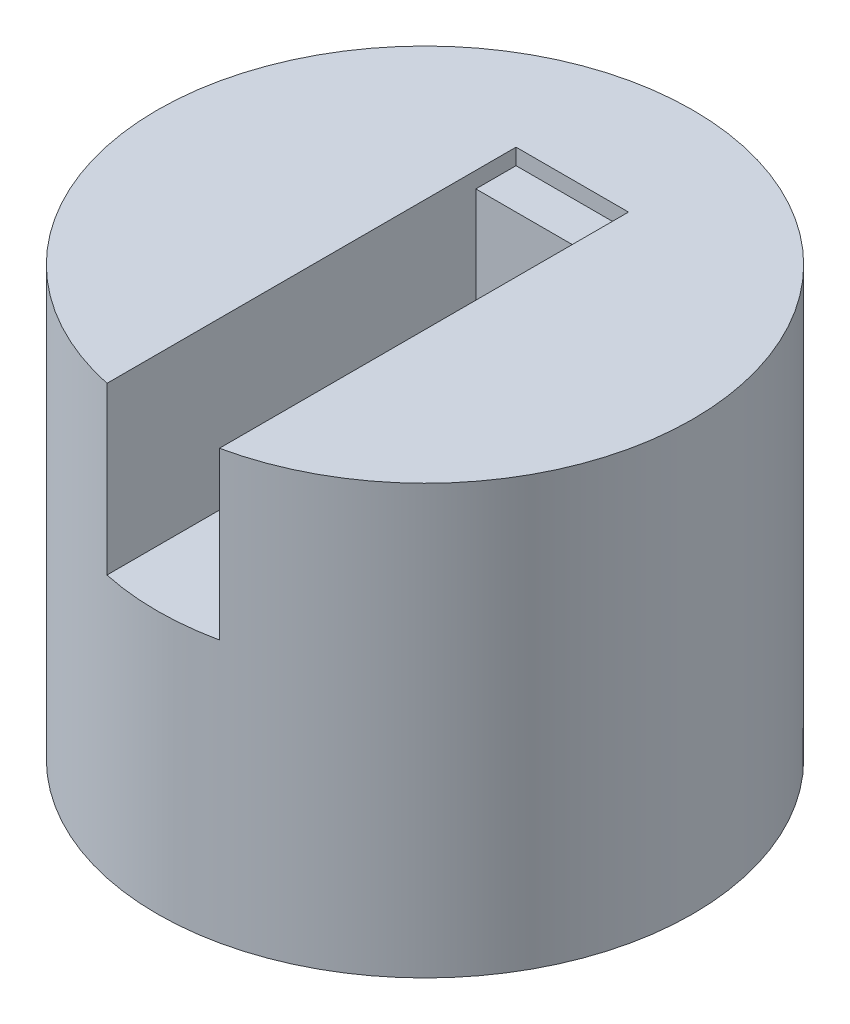
ISO-10303-21;
HEADER;
FILE_DESCRIPTION(('STEP AP214'),'2;1');
FILE_NAME('part.step','',(''),(''),'','','');
FILE_SCHEMA(('AUTOMOTIVE_DESIGN { 1 0 10303 214 1 1 1 1 }'));
ENDSEC;
DATA;
#1=APPLICATION_CONTEXT('core data for automotive mechanical design processes');
#2=APPLICATION_PROTOCOL_DEFINITION('international standard','automotive_design',2000,#1);
#3=PRODUCT_CONTEXT('',#1,'mechanical');
#4=PRODUCT('Part','Part','',(#3));
#5=PRODUCT_RELATED_PRODUCT_CATEGORY('part','',(#4));
#6=PRODUCT_DEFINITION_FORMATION('','',#4);
#7=PRODUCT_DEFINITION_CONTEXT('part definition',#1,'design');
#8=PRODUCT_DEFINITION('design','',#6,#7);
#9=PRODUCT_DEFINITION_SHAPE('','',#8);
#10=(LENGTH_UNIT() NAMED_UNIT(*) SI_UNIT(.MILLI.,.METRE.));
#11=(NAMED_UNIT(*) PLANE_ANGLE_UNIT() SI_UNIT($,.RADIAN.));
#12=(NAMED_UNIT(*) SI_UNIT($,.STERADIAN.) SOLID_ANGLE_UNIT());
#13=UNCERTAINTY_MEASURE_WITH_UNIT(LENGTH_MEASURE(1.E-05),#10,'distance_accuracy_value','');
#14=(GEOMETRIC_REPRESENTATION_CONTEXT(3) GLOBAL_UNCERTAINTY_ASSIGNED_CONTEXT((#13)) GLOBAL_UNIT_ASSIGNED_CONTEXT((#10,
#11,#12)) REPRESENTATION_CONTEXT('',''));
#15=CARTESIAN_POINT('',(0.,0.,0.));
#16=DIRECTION('',(0.,0.,1.));
#17=DIRECTION('',(1.,0.,0.));
#18=AXIS2_PLACEMENT_3D('',#15,#16,#17);
#19=CARTESIAN_POINT('',(0.,80.,0.));
#20=DIRECTION('',(0.,-1.,0.));
#21=DIRECTION('',(0.,0.,-1.));
#22=AXIS2_PLACEMENT_3D('',#19,#20,#21);
#23=CYLINDRICAL_SURFACE('',#22,50.);
#24=CARTESIAN_POINT('',(0.,0.,0.));
#25=DIRECTION('',(0.,1.,0.));
#26=DIRECTION('',(0.,0.,1.));
#27=AXIS2_PLACEMENT_3D('',#24,#25,#26);
#28=CIRCLE('',#27,50.);
#29=CARTESIAN_POINT('',(0.,0.,50.));
#30=VERTEX_POINT('',#29);
#31=EDGE_CURVE('E48',#30,#30,#28,.T.);
#32=ORIENTED_EDGE('',*,*,#31,.T.);
#33=EDGE_LOOP('',(#32));
#34=FACE_BOUND('',#33,.T.);
#35=DIRECTION('',(0.,-1.,0.));
#36=VECTOR('',#35,1.);
#37=CARTESIAN_POINT('',(-10.5,80.,48.8850692952357));
#38=LINE('',#37,#36);
#39=CARTESIAN_POINT('',(-10.5,80.,48.8850692952357));
#40=VERTEX_POINT('',#39);
#41=CARTESIAN_POINT('',(-10.5,49.,48.8850692952357));
#42=VERTEX_POINT('',#41);
#43=EDGE_CURVE('E195',#40,#42,#38,.T.);
#44=ORIENTED_EDGE('',*,*,#43,.F.);
#45=CARTESIAN_POINT('',(0.,80.,0.));
#46=DIRECTION('',(0.,1.,0.));
#47=DIRECTION('',(0.,0.,1.));
#48=AXIS2_PLACEMENT_3D('',#45,#46,#47);
#49=CIRCLE('',#48,50.);
#50=CARTESIAN_POINT('',(10.5,80.,48.8850692952357));
#51=VERTEX_POINT('',#50);
#52=EDGE_CURVE('E11',#51,#40,#49,.T.);
#53=ORIENTED_EDGE('',*,*,#52,.F.);
#54=DIRECTION('',(0.,-1.,0.));
#55=VECTOR('',#54,1.);
#56=CARTESIAN_POINT('',(10.5,80.,48.8850692952357));
#57=LINE('',#56,#55);
#58=CARTESIAN_POINT('',(10.5,49.,48.8850692952357));
#59=VERTEX_POINT('',#58);
#60=EDGE_CURVE('E198',#59,#51,#57,.F.);
#61=ORIENTED_EDGE('',*,*,#60,.F.);
#62=CARTESIAN_POINT('',(0.,49.,0.));
#63=DIRECTION('',(0.,1.,0.));
#64=DIRECTION('',(0.,0.,1.));
#65=AXIS2_PLACEMENT_3D('',#62,#63,#64);
#66=CIRCLE('',#65,50.);
#67=EDGE_CURVE('E114',#42,#59,#66,.T.);
#68=ORIENTED_EDGE('',*,*,#67,.F.);
#69=EDGE_LOOP('',(#44,#53,#61,#68));
#70=FACE_BOUND('',#69,.T.);
#71=ADVANCED_FACE('F45',(#34,#70),#23,.T.);
#72=CARTESIAN_POINT('',(0.,80.,0.));
#73=DIRECTION('',(0.,1.,0.));
#74=DIRECTION('',(0.,0.,1.));
#75=AXIS2_PLACEMENT_3D('',#72,#73,#74);
#76=PLANE('',#75);
#77=ORIENTED_EDGE('',*,*,#52,.T.);
#78=DIRECTION('',(0.,0.,1.));
#79=VECTOR('',#78,1.);
#80=CARTESIAN_POINT('',(-10.5,80.,-27.5));
#81=LINE('',#80,#79);
#82=CARTESIAN_POINT('',(-10.5,80.,-27.5));
#83=VERTEX_POINT('',#82);
#84=EDGE_CURVE('E133',#83,#40,#81,.T.);
#85=ORIENTED_EDGE('',*,*,#84,.F.);
#86=DIRECTION('',(-1.,0.,0.));
#87=VECTOR('',#86,1.);
#88=CARTESIAN_POINT('',(-10.5,80.,-27.5));
#89=LINE('',#88,#87);
#90=CARTESIAN_POINT('',(10.5,80.,-27.5));
#91=VERTEX_POINT('',#90);
#92=EDGE_CURVE('E130',#91,#83,#89,.T.);
#93=ORIENTED_EDGE('',*,*,#92,.F.);
#94=DIRECTION('',(0.,0.,-1.));
#95=VECTOR('',#94,1.);
#96=CARTESIAN_POINT('',(10.5,80.,-27.5));
#97=LINE('',#96,#95);
#98=EDGE_CURVE('E60',#51,#91,#97,.T.);
#99=ORIENTED_EDGE('',*,*,#98,.F.);
#100=EDGE_LOOP('',(#77,#85,#93,#99));
#101=FACE_BOUND('',#100,.T.);
#102=ADVANCED_FACE('F152',(#101),#76,.T.);
#103=CARTESIAN_POINT('',(0.,77.,0.));
#104=DIRECTION('',(0.,1.,0.));
#105=DIRECTION('',(0.,0.,1.));
#106=AXIS2_PLACEMENT_3D('',#103,#104,#105);
#107=PLANE('',#106);
#108=DIRECTION('',(-1.,0.,0.));
#109=VECTOR('',#108,1.);
#110=CARTESIAN_POINT('',(-10.5,77.,-20.));
#111=LINE('',#110,#109);
#112=CARTESIAN_POINT('',(10.5,77.,-20.));
#113=VERTEX_POINT('',#112);
#114=CARTESIAN_POINT('',(-10.5,77.,-20.));
#115=VERTEX_POINT('',#114);
#116=EDGE_CURVE('E107',#113,#115,#111,.T.);
#117=ORIENTED_EDGE('',*,*,#116,.F.);
#118=DIRECTION('',(0.,0.,-1.));
#119=VECTOR('',#118,1.);
#120=CARTESIAN_POINT('',(10.5,77.,-27.5));
#121=LINE('',#120,#119);
#122=CARTESIAN_POINT('',(10.5,77.,-27.5));
#123=VERTEX_POINT('',#122);
#124=EDGE_CURVE('E124',#113,#123,#121,.T.);
#125=ORIENTED_EDGE('',*,*,#124,.T.);
#126=DIRECTION('',(-1.,0.,0.));
#127=VECTOR('',#126,1.);
#128=CARTESIAN_POINT('',(-10.5,77.,-27.5));
#129=LINE('',#128,#127);
#130=CARTESIAN_POINT('',(-10.5,77.,-27.5));
#131=VERTEX_POINT('',#130);
#132=EDGE_CURVE('E117',#123,#131,#129,.T.);
#133=ORIENTED_EDGE('',*,*,#132,.T.);
#134=DIRECTION('',(0.,0.,1.));
#135=VECTOR('',#134,1.);
#136=CARTESIAN_POINT('',(-10.5,77.,-27.5));
#137=LINE('',#136,#135);
#138=EDGE_CURVE('E97',#131,#115,#137,.T.);
#139=ORIENTED_EDGE('',*,*,#138,.T.);
#140=EDGE_LOOP('',(#117,#125,#133,#139));
#141=FACE_BOUND('',#140,.T.);
#142=ADVANCED_FACE('F116',(#141),#107,.T.);
#143=CARTESIAN_POINT('',(0.,0.,0.));
#144=DIRECTION('',(0.,1.,0.));
#145=DIRECTION('',(0.,0.,1.));
#146=AXIS2_PLACEMENT_3D('',#143,#144,#145);
#147=PLANE('',#146);
#148=ORIENTED_EDGE('',*,*,#31,.F.);
#149=EDGE_LOOP('',(#148));
#150=FACE_BOUND('',#149,.T.);
#151=ADVANCED_FACE('F143',(#150),#147,.F.);
#152=CARTESIAN_POINT('',(10.5,77.,-27.5));
#153=DIRECTION('',(1.,0.,0.));
#154=DIRECTION('',(0.,0.,-1.));
#155=AXIS2_PLACEMENT_3D('',#152,#153,#154);
#156=PLANE('',#155);
#157=ORIENTED_EDGE('',*,*,#60,.T.);
#158=ORIENTED_EDGE('',*,*,#98,.T.);
#159=DIRECTION('',(0.,1.,0.));
#160=VECTOR('',#159,1.);
#161=CARTESIAN_POINT('',(10.5,77.,-27.5));
#162=LINE('',#161,#160);
#163=EDGE_CURVE('E119',#123,#91,#162,.T.);
#164=ORIENTED_EDGE('',*,*,#163,.F.);
#165=ORIENTED_EDGE('',*,*,#124,.F.);
#166=DIRECTION('',(0.,1.,0.));
#167=VECTOR('',#166,1.);
#168=CARTESIAN_POINT('',(10.5,49.,-20.));
#169=LINE('',#168,#167);
#170=CARTESIAN_POINT('',(10.5,49.,-20.));
#171=VERTEX_POINT('',#170);
#172=EDGE_CURVE('E104',#171,#113,#169,.T.);
#173=ORIENTED_EDGE('',*,*,#172,.F.);
#174=DIRECTION('',(0.,0.,-1.));
#175=VECTOR('',#174,1.);
#176=CARTESIAN_POINT('',(10.5,49.,-20.));
#177=LINE('',#176,#175);
#178=EDGE_CURVE('E113',#59,#171,#177,.T.);
#179=ORIENTED_EDGE('',*,*,#178,.F.);
#180=EDGE_LOOP('',(#157,#158,#164,#165,#173,#179));
#181=FACE_BOUND('',#180,.T.);
#182=ADVANCED_FACE('F145',(#181),#156,.F.);
#183=CARTESIAN_POINT('',(-10.5,77.,-27.5));
#184=DIRECTION('',(-1.,0.,0.));
#185=DIRECTION('',(0.,0.,1.));
#186=AXIS2_PLACEMENT_3D('',#183,#184,#185);
#187=PLANE('',#186);
#188=ORIENTED_EDGE('',*,*,#84,.T.);
#189=ORIENTED_EDGE('',*,*,#43,.T.);
#190=DIRECTION('',(0.,0.,1.));
#191=VECTOR('',#190,1.);
#192=CARTESIAN_POINT('',(-10.5,49.,-20.));
#193=LINE('',#192,#191);
#194=CARTESIAN_POINT('',(-10.5,49.,-20.));
#195=VERTEX_POINT('',#194);
#196=EDGE_CURVE('E101',#195,#42,#193,.T.);
#197=ORIENTED_EDGE('',*,*,#196,.F.);
#198=DIRECTION('',(0.,1.,0.));
#199=VECTOR('',#198,1.);
#200=CARTESIAN_POINT('',(-10.5,49.,-20.));
#201=LINE('',#200,#199);
#202=EDGE_CURVE('E85',#195,#115,#201,.T.);
#203=ORIENTED_EDGE('',*,*,#202,.T.);
#204=ORIENTED_EDGE('',*,*,#138,.F.);
#205=DIRECTION('',(0.,1.,0.));
#206=VECTOR('',#205,1.);
#207=CARTESIAN_POINT('',(-10.5,77.,-27.5));
#208=LINE('',#207,#206);
#209=EDGE_CURVE('E69',#131,#83,#208,.T.);
#210=ORIENTED_EDGE('',*,*,#209,.T.);
#211=EDGE_LOOP('',(#188,#189,#197,#203,#204,#210));
#212=FACE_BOUND('',#211,.T.);
#213=ADVANCED_FACE('F95',(#212),#187,.F.);
#214=CARTESIAN_POINT('',(-10.5,77.,-27.5));
#215=DIRECTION('',(0.,0.,-1.));
#216=DIRECTION('',(-1.,0.,0.));
#217=AXIS2_PLACEMENT_3D('',#214,#215,#216);
#218=PLANE('',#217);
#219=ORIENTED_EDGE('',*,*,#92,.T.);
#220=ORIENTED_EDGE('',*,*,#209,.F.);
#221=ORIENTED_EDGE('',*,*,#132,.F.);
#222=ORIENTED_EDGE('',*,*,#163,.T.);
#223=EDGE_LOOP('',(#219,#220,#221,#222));
#224=FACE_BOUND('',#223,.T.);
#225=ADVANCED_FACE('F164',(#224),#218,.F.);
#226=CARTESIAN_POINT('',(-10.5,49.,-20.));
#227=DIRECTION('',(0.,0.,-1.));
#228=DIRECTION('',(-1.,0.,0.));
#229=AXIS2_PLACEMENT_3D('',#226,#227,#228);
#230=PLANE('',#229);
#231=ORIENTED_EDGE('',*,*,#116,.T.);
#232=ORIENTED_EDGE('',*,*,#202,.F.);
#233=DIRECTION('',(-1.,0.,0.));
#234=VECTOR('',#233,1.);
#235=CARTESIAN_POINT('',(-10.5,49.,-20.));
#236=LINE('',#235,#234);
#237=EDGE_CURVE('E176',#171,#195,#236,.T.);
#238=ORIENTED_EDGE('',*,*,#237,.F.);
#239=ORIENTED_EDGE('',*,*,#172,.T.);
#240=EDGE_LOOP('',(#231,#232,#238,#239));
#241=FACE_BOUND('',#240,.T.);
#242=ADVANCED_FACE('F108',(#241),#230,.F.);
#243=CARTESIAN_POINT('',(0.,49.,0.));
#244=DIRECTION('',(0.,1.,0.));
#245=DIRECTION('',(0.,0.,1.));
#246=AXIS2_PLACEMENT_3D('',#243,#244,#245);
#247=PLANE('',#246);
#248=ORIENTED_EDGE('',*,*,#178,.T.);
#249=ORIENTED_EDGE('',*,*,#237,.T.);
#250=ORIENTED_EDGE('',*,*,#196,.T.);
#251=ORIENTED_EDGE('',*,*,#67,.T.);
#252=EDGE_LOOP('',(#248,#249,#250,#251));
#253=FACE_BOUND('',#252,.T.);
#254=ADVANCED_FACE('F169',(#253),#247,.T.);
#255=CLOSED_SHELL('',(#71,#102,#142,#151,#182,#213,#225,#242,#254));
#256=MANIFOLD_SOLID_BREP('B2',#255);
#257=ADVANCED_BREP_SHAPE_REPRESENTATION('',(#18,#256),#14);
#258=SHAPE_DEFINITION_REPRESENTATION(#9,#257);
ENDSEC;
END-ISO-10303-21;
